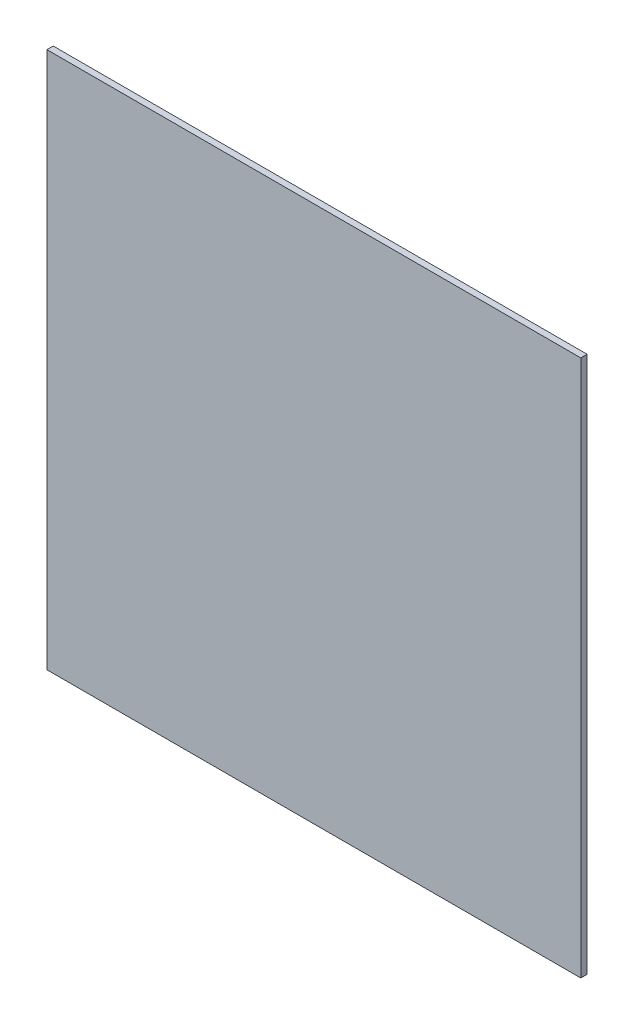
ISO-10303-21;
HEADER;
FILE_DESCRIPTION(('STEP AP214'),'2;1');
FILE_NAME('part.step','',(''),(''),'','','');
FILE_SCHEMA(('AUTOMOTIVE_DESIGN { 1 0 10303 214 1 1 1 1 }'));
ENDSEC;
DATA;
#1=APPLICATION_CONTEXT('core data for automotive mechanical design processes');
#2=APPLICATION_PROTOCOL_DEFINITION('international standard','automotive_design',2000,#1);
#3=PRODUCT_CONTEXT('',#1,'mechanical');
#4=PRODUCT('Part','Part','',(#3));
#5=PRODUCT_RELATED_PRODUCT_CATEGORY('part','',(#4));
#6=PRODUCT_DEFINITION_FORMATION('','',#4);
#7=PRODUCT_DEFINITION_CONTEXT('part definition',#1,'design');
#8=PRODUCT_DEFINITION('design','',#6,#7);
#9=PRODUCT_DEFINITION_SHAPE('','',#8);
#10=(LENGTH_UNIT() NAMED_UNIT(*) SI_UNIT(.MILLI.,.METRE.));
#11=(NAMED_UNIT(*) PLANE_ANGLE_UNIT() SI_UNIT($,.RADIAN.));
#12=(NAMED_UNIT(*) SI_UNIT($,.STERADIAN.) SOLID_ANGLE_UNIT());
#13=UNCERTAINTY_MEASURE_WITH_UNIT(LENGTH_MEASURE(1.E-05),#10,'distance_accuracy_value','');
#14=(GEOMETRIC_REPRESENTATION_CONTEXT(3) GLOBAL_UNCERTAINTY_ASSIGNED_CONTEXT((#13)) GLOBAL_UNIT_ASSIGNED_CONTEXT((#10,
#11,#12)) REPRESENTATION_CONTEXT('',''));
#15=CARTESIAN_POINT('',(0.,0.,0.));
#16=DIRECTION('',(0.,0.,1.));
#17=DIRECTION('',(1.,0.,0.));
#18=AXIS2_PLACEMENT_3D('',#15,#16,#17);
#19=CARTESIAN_POINT('',(-84.5,-85.,2.));
#20=DIRECTION('',(1.,0.,0.));
#21=DIRECTION('',(0.,0.,-1.));
#22=AXIS2_PLACEMENT_3D('',#19,#20,#21);
#23=PLANE('',#22);
#24=DIRECTION('',(0.,-1.,0.));
#25=VECTOR('',#24,1.);
#26=CARTESIAN_POINT('',(-84.5,-85.,0.));
#27=LINE('',#26,#25);
#28=CARTESIAN_POINT('',(-84.5,85.,0.));
#29=VERTEX_POINT('',#28);
#30=CARTESIAN_POINT('',(-84.5,-85.,0.));
#31=VERTEX_POINT('',#30);
#32=EDGE_CURVE('E111',#29,#31,#27,.T.);
#33=ORIENTED_EDGE('',*,*,#32,.T.);
#34=DIRECTION('',(0.,0.,-1.));
#35=VECTOR('',#34,1.);
#36=CARTESIAN_POINT('',(-84.5,-85.,2.));
#37=LINE('',#36,#35);
#38=CARTESIAN_POINT('',(-84.5,-85.,2.));
#39=VERTEX_POINT('',#38);
#40=EDGE_CURVE('E11',#39,#31,#37,.T.);
#41=ORIENTED_EDGE('',*,*,#40,.F.);
#42=DIRECTION('',(0.,-1.,0.));
#43=VECTOR('',#42,1.);
#44=CARTESIAN_POINT('',(-84.5,-85.,2.));
#45=LINE('',#44,#43);
#46=CARTESIAN_POINT('',(-84.5,85.,2.));
#47=VERTEX_POINT('',#46);
#48=EDGE_CURVE('E95',#47,#39,#45,.T.);
#49=ORIENTED_EDGE('',*,*,#48,.F.);
#50=DIRECTION('',(0.,0.,-1.));
#51=VECTOR('',#50,1.);
#52=CARTESIAN_POINT('',(-84.5,85.,2.));
#53=LINE('',#52,#51);
#54=EDGE_CURVE('E107',#47,#29,#53,.T.);
#55=ORIENTED_EDGE('',*,*,#54,.T.);
#56=EDGE_LOOP('',(#33,#41,#49,#55));
#57=FACE_BOUND('',#56,.T.);
#58=ADVANCED_FACE('F43',(#57),#23,.F.);
#59=CARTESIAN_POINT('',(84.5,-85.,2.));
#60=DIRECTION('',(0.,1.,0.));
#61=DIRECTION('',(-1.,0.,0.));
#62=AXIS2_PLACEMENT_3D('',#59,#60,#61);
#63=PLANE('',#62);
#64=DIRECTION('',(1.,0.,0.));
#65=VECTOR('',#64,1.);
#66=CARTESIAN_POINT('',(84.5,-85.,0.));
#67=LINE('',#66,#65);
#68=CARTESIAN_POINT('',(84.5,-85.,0.));
#69=VERTEX_POINT('',#68);
#70=EDGE_CURVE('E100',#31,#69,#67,.T.);
#71=ORIENTED_EDGE('',*,*,#70,.T.);
#72=DIRECTION('',(0.,0.,-1.));
#73=VECTOR('',#72,1.);
#74=CARTESIAN_POINT('',(84.5,-85.,2.));
#75=LINE('',#74,#73);
#76=CARTESIAN_POINT('',(84.5,-85.,2.));
#77=VERTEX_POINT('',#76);
#78=EDGE_CURVE('E52',#77,#69,#75,.T.);
#79=ORIENTED_EDGE('',*,*,#78,.F.);
#80=DIRECTION('',(1.,0.,0.));
#81=VECTOR('',#80,1.);
#82=CARTESIAN_POINT('',(84.5,-85.,2.));
#83=LINE('',#82,#81);
#84=EDGE_CURVE('E90',#39,#77,#83,.T.);
#85=ORIENTED_EDGE('',*,*,#84,.F.);
#86=ORIENTED_EDGE('',*,*,#40,.T.);
#87=EDGE_LOOP('',(#71,#79,#85,#86));
#88=FACE_BOUND('',#87,.T.);
#89=ADVANCED_FACE('F99',(#88),#63,.F.);
#90=CARTESIAN_POINT('',(84.5,-85.,2.));
#91=DIRECTION('',(-1.,0.,0.));
#92=DIRECTION('',(0.,0.,1.));
#93=AXIS2_PLACEMENT_3D('',#90,#91,#92);
#94=PLANE('',#93);
#95=DIRECTION('',(0.,1.,0.));
#96=VECTOR('',#95,1.);
#97=CARTESIAN_POINT('',(84.5,-85.,0.));
#98=LINE('',#97,#96);
#99=CARTESIAN_POINT('',(84.5,85.,0.));
#100=VERTEX_POINT('',#99);
#101=EDGE_CURVE('E77',#69,#100,#98,.T.);
#102=ORIENTED_EDGE('',*,*,#101,.T.);
#103=DIRECTION('',(0.,0.,-1.));
#104=VECTOR('',#103,1.);
#105=CARTESIAN_POINT('',(84.5,85.,2.));
#106=LINE('',#105,#104);
#107=CARTESIAN_POINT('',(84.5,85.,2.));
#108=VERTEX_POINT('',#107);
#109=EDGE_CURVE('E102',#108,#100,#106,.T.);
#110=ORIENTED_EDGE('',*,*,#109,.F.);
#111=DIRECTION('',(0.,1.,0.));
#112=VECTOR('',#111,1.);
#113=CARTESIAN_POINT('',(84.5,-85.,2.));
#114=LINE('',#113,#112);
#115=EDGE_CURVE('E93',#77,#108,#114,.T.);
#116=ORIENTED_EDGE('',*,*,#115,.F.);
#117=ORIENTED_EDGE('',*,*,#78,.T.);
#118=EDGE_LOOP('',(#102,#110,#116,#117));
#119=FACE_BOUND('',#118,.T.);
#120=ADVANCED_FACE('F103',(#119),#94,.F.);
#121=CARTESIAN_POINT('',(84.5,85.,2.));
#122=DIRECTION('',(0.,-1.,0.));
#123=DIRECTION('',(1.,0.,0.));
#124=AXIS2_PLACEMENT_3D('',#121,#122,#123);
#125=PLANE('',#124);
#126=DIRECTION('',(-1.,0.,0.));
#127=VECTOR('',#126,1.);
#128=CARTESIAN_POINT('',(84.5,85.,0.));
#129=LINE('',#128,#127);
#130=EDGE_CURVE('E83',#100,#29,#129,.T.);
#131=ORIENTED_EDGE('',*,*,#130,.T.);
#132=ORIENTED_EDGE('',*,*,#54,.F.);
#133=DIRECTION('',(-1.,0.,0.));
#134=VECTOR('',#133,1.);
#135=CARTESIAN_POINT('',(84.5,85.,2.));
#136=LINE('',#135,#134);
#137=EDGE_CURVE('E60',#108,#47,#136,.T.);
#138=ORIENTED_EDGE('',*,*,#137,.F.);
#139=ORIENTED_EDGE('',*,*,#109,.T.);
#140=EDGE_LOOP('',(#131,#132,#138,#139));
#141=FACE_BOUND('',#140,.T.);
#142=ADVANCED_FACE('F124',(#141),#125,.F.);
#143=CARTESIAN_POINT('',(0.,0.,2.));
#144=DIRECTION('',(0.,0.,1.));
#145=DIRECTION('',(1.,0.,0.));
#146=AXIS2_PLACEMENT_3D('',#143,#144,#145);
#147=PLANE('',#146);
#148=ORIENTED_EDGE('',*,*,#48,.T.);
#149=ORIENTED_EDGE('',*,*,#84,.T.);
#150=ORIENTED_EDGE('',*,*,#115,.T.);
#151=ORIENTED_EDGE('',*,*,#137,.T.);
#152=EDGE_LOOP('',(#148,#149,#150,#151));
#153=FACE_BOUND('',#152,.T.);
#154=ADVANCED_FACE('F91',(#153),#147,.T.);
#155=CARTESIAN_POINT('',(0.,0.,0.));
#156=DIRECTION('',(0.,0.,1.));
#157=DIRECTION('',(1.,0.,0.));
#158=AXIS2_PLACEMENT_3D('',#155,#156,#157);
#159=PLANE('',#158);
#160=ORIENTED_EDGE('',*,*,#32,.F.);
#161=ORIENTED_EDGE('',*,*,#130,.F.);
#162=ORIENTED_EDGE('',*,*,#101,.F.);
#163=ORIENTED_EDGE('',*,*,#70,.F.);
#164=EDGE_LOOP('',(#160,#161,#162,#163));
#165=FACE_BOUND('',#164,.T.);
#166=ADVANCED_FACE('F127',(#165),#159,.F.);
#167=CLOSED_SHELL('',(#58,#89,#120,#142,#154,#166));
#168=MANIFOLD_SOLID_BREP('B2',#167);
#169=ADVANCED_BREP_SHAPE_REPRESENTATION('',(#18,#168),#14);
#170=SHAPE_DEFINITION_REPRESENTATION(#9,#169);
ENDSEC;
END-ISO-10303-21;
